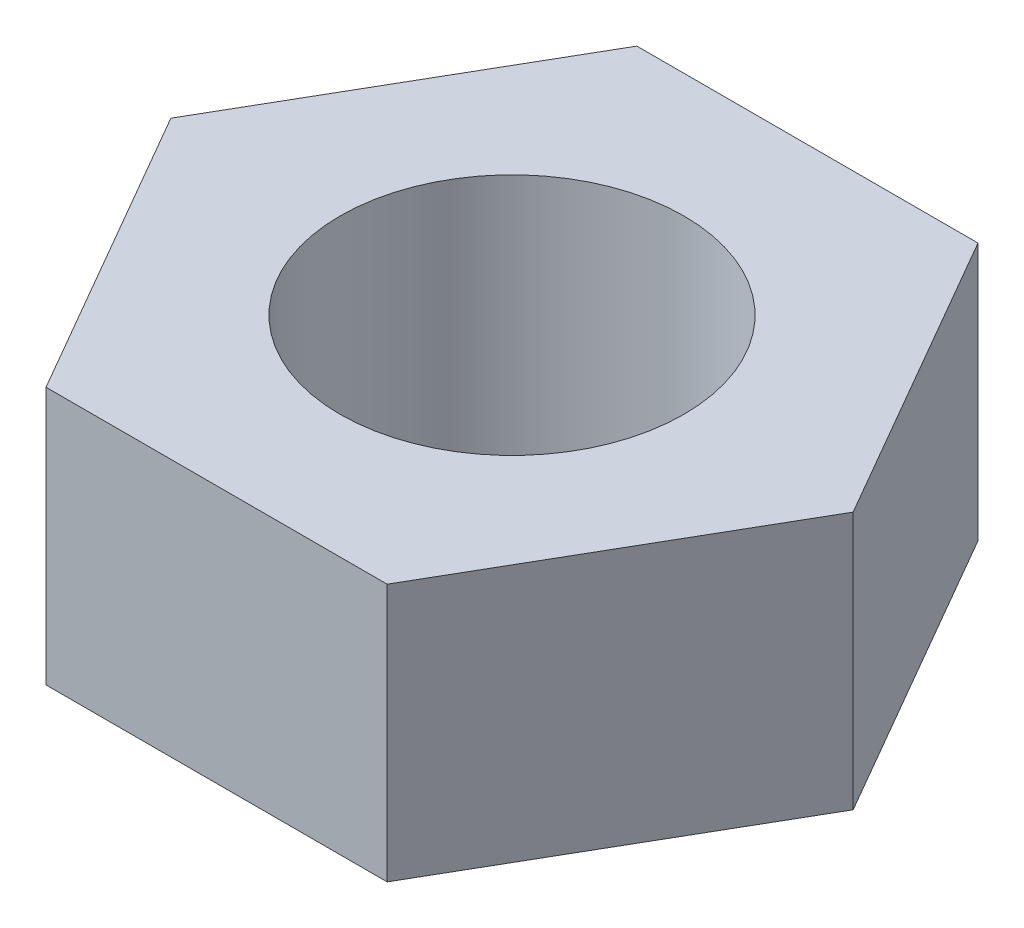
ISO-10303-21;
HEADER;
FILE_DESCRIPTION(('STEP AP214'),'2;1');
FILE_NAME('part.step','',(''),(''),'','','');
FILE_SCHEMA(('AUTOMOTIVE_DESIGN { 1 0 10303 214 1 1 1 1 }'));
ENDSEC;
DATA;
#1=APPLICATION_CONTEXT('core data for automotive mechanical design processes');
#2=APPLICATION_PROTOCOL_DEFINITION('international standard','automotive_design',2000,#1);
#3=PRODUCT_CONTEXT('',#1,'mechanical');
#4=PRODUCT('Part','Part','',(#3));
#5=PRODUCT_RELATED_PRODUCT_CATEGORY('part','',(#4));
#6=PRODUCT_DEFINITION_FORMATION('','',#4);
#7=PRODUCT_DEFINITION_CONTEXT('part definition',#1,'design');
#8=PRODUCT_DEFINITION('design','',#6,#7);
#9=PRODUCT_DEFINITION_SHAPE('','',#8);
#10=(LENGTH_UNIT() NAMED_UNIT(*) SI_UNIT(.MILLI.,.METRE.));
#11=(NAMED_UNIT(*) PLANE_ANGLE_UNIT() SI_UNIT($,.RADIAN.));
#12=(NAMED_UNIT(*) SI_UNIT($,.STERADIAN.) SOLID_ANGLE_UNIT());
#13=UNCERTAINTY_MEASURE_WITH_UNIT(LENGTH_MEASURE(1.E-05),#10,'distance_accuracy_value','');
#14=(GEOMETRIC_REPRESENTATION_CONTEXT(3) GLOBAL_UNCERTAINTY_ASSIGNED_CONTEXT((#13)) GLOBAL_UNIT_ASSIGNED_CONTEXT((#10,
#11,#12)) REPRESENTATION_CONTEXT('',''));
#15=CARTESIAN_POINT('',(0.,0.,0.));
#16=DIRECTION('',(0.,0.,1.));
#17=DIRECTION('',(1.,0.,0.));
#18=AXIS2_PLACEMENT_3D('',#15,#16,#17);
#19=CARTESIAN_POINT('',(0.,159.9,0.));
#20=DIRECTION('',(0.,1.,0.));
#21=DIRECTION('',(0.,0.,1.));
#22=AXIS2_PLACEMENT_3D('',#19,#20,#21);
#23=PLANE('',#22);
#24=DIRECTION('',(1.,0.,0.));
#25=VECTOR('',#24,1.);
#26=CARTESIAN_POINT('',(-57.87936448626,159.9,52.75));
#27=LINE('',#26,#25);
#28=CARTESIAN_POINT('',(-57.87936448626,159.9,52.75));
#29=VERTEX_POINT('',#28);
#30=CARTESIAN_POINT('',(-54.7039380057171,159.9,52.75));
#31=VERTEX_POINT('',#30);
#32=EDGE_CURVE('E137',#29,#31,#27,.T.);
#33=ORIENTED_EDGE('',*,*,#32,.T.);
#34=DIRECTION('',(0.500000000000002,0.,-0.866025403784437));
#35=VECTOR('',#34,1.);
#36=CARTESIAN_POINT('',(-54.7039380057171,159.9,52.75));
#37=LINE('',#36,#35);
#38=CARTESIAN_POINT('',(-53.1162247654456,159.9,50.));
#39=VERTEX_POINT('',#38);
#40=EDGE_CURVE('E92',#31,#39,#37,.T.);
#41=ORIENTED_EDGE('',*,*,#40,.T.);
#42=DIRECTION('',(-0.499999999999998,0.,-0.86602540378444));
#43=VECTOR('',#42,1.);
#44=CARTESIAN_POINT('',(-53.1162247654456,159.9,50.));
#45=LINE('',#44,#43);
#46=CARTESIAN_POINT('',(-54.703938005717,159.9,47.25));
#47=VERTEX_POINT('',#46);
#48=EDGE_CURVE('E107',#39,#47,#45,.T.);
#49=ORIENTED_EDGE('',*,*,#48,.T.);
#50=DIRECTION('',(-1.,0.,0.));
#51=VECTOR('',#50,1.);
#52=CARTESIAN_POINT('',(-54.703938005717,159.9,47.25));
#53=LINE('',#52,#51);
#54=CARTESIAN_POINT('',(-57.87936448626,159.9,47.25));
#55=VERTEX_POINT('',#54);
#56=EDGE_CURVE('E105',#47,#55,#53,.T.);
#57=ORIENTED_EDGE('',*,*,#56,.T.);
#58=DIRECTION('',(-0.5,0.,0.866025403784438));
#59=VECTOR('',#58,1.);
#60=CARTESIAN_POINT('',(-57.87936448626,159.9,47.25));
#61=LINE('',#60,#59);
#62=CARTESIAN_POINT('',(-59.4670777265315,159.9,50.));
#63=VERTEX_POINT('',#62);
#64=EDGE_CURVE('E106',#55,#63,#61,.T.);
#65=ORIENTED_EDGE('',*,*,#64,.T.);
#66=DIRECTION('',(0.500000000000001,0.,0.866025403784438));
#67=VECTOR('',#66,1.);
#68=CARTESIAN_POINT('',(-59.4670777265315,159.9,50.));
#69=LINE('',#68,#67);
#70=EDGE_CURVE('E59',#63,#29,#69,.T.);
#71=ORIENTED_EDGE('',*,*,#70,.T.);
#72=EDGE_LOOP('',(#33,#41,#49,#57,#65,#71));
#73=FACE_BOUND('',#72,.T.);
#74=CARTESIAN_POINT('',(-56.2916512459885,159.9,50.));
#75=DIRECTION('',(0.,1.,0.));
#76=DIRECTION('',(0.,0.,1.));
#77=AXIS2_PLACEMENT_3D('',#74,#75,#76);
#78=CIRCLE('',#77,1.6);
#79=CARTESIAN_POINT('',(-56.2916512459885,159.9,51.6));
#80=VERTEX_POINT('',#79);
#81=EDGE_CURVE('E128',#80,#80,#78,.T.);
#82=ORIENTED_EDGE('',*,*,#81,.F.);
#83=EDGE_LOOP('',(#82));
#84=FACE_BOUND('',#83,.T.);
#85=ADVANCED_FACE('F41',(#73,#84),#23,.T.);
#86=CARTESIAN_POINT('',(0.,157.5,0.));
#87=DIRECTION('',(0.,1.,0.));
#88=DIRECTION('',(0.,0.,1.));
#89=AXIS2_PLACEMENT_3D('',#86,#87,#88);
#90=PLANE('',#89);
#91=DIRECTION('',(1.,0.,0.));
#92=VECTOR('',#91,1.);
#93=CARTESIAN_POINT('',(-57.87936448626,157.5,52.75));
#94=LINE('',#93,#92);
#95=CARTESIAN_POINT('',(-57.87936448626,157.5,52.75));
#96=VERTEX_POINT('',#95);
#97=CARTESIAN_POINT('',(-54.7039380057171,157.5,52.75));
#98=VERTEX_POINT('',#97);
#99=EDGE_CURVE('E127',#96,#98,#94,.T.);
#100=ORIENTED_EDGE('',*,*,#99,.F.);
#101=DIRECTION('',(0.500000000000001,0.,0.866025403784438));
#102=VECTOR('',#101,1.);
#103=CARTESIAN_POINT('',(-59.4670777265315,157.5,50.));
#104=LINE('',#103,#102);
#105=CARTESIAN_POINT('',(-59.4670777265315,157.5,50.));
#106=VERTEX_POINT('',#105);
#107=EDGE_CURVE('E87',#106,#96,#104,.T.);
#108=ORIENTED_EDGE('',*,*,#107,.F.);
#109=DIRECTION('',(-0.5,0.,0.866025403784438));
#110=VECTOR('',#109,1.);
#111=CARTESIAN_POINT('',(-57.87936448626,157.5,47.25));
#112=LINE('',#111,#110);
#113=CARTESIAN_POINT('',(-57.87936448626,157.5,47.25));
#114=VERTEX_POINT('',#113);
#115=EDGE_CURVE('E81',#114,#106,#112,.T.);
#116=ORIENTED_EDGE('',*,*,#115,.F.);
#117=DIRECTION('',(-1.,0.,0.));
#118=VECTOR('',#117,1.);
#119=CARTESIAN_POINT('',(-54.703938005717,157.5,47.25));
#120=LINE('',#119,#118);
#121=CARTESIAN_POINT('',(-54.703938005717,157.5,47.25));
#122=VERTEX_POINT('',#121);
#123=EDGE_CURVE('E117',#122,#114,#120,.T.);
#124=ORIENTED_EDGE('',*,*,#123,.F.);
#125=DIRECTION('',(-0.499999999999998,0.,-0.86602540378444));
#126=VECTOR('',#125,1.);
#127=CARTESIAN_POINT('',(-53.1162247654456,157.5,50.));
#128=LINE('',#127,#126);
#129=CARTESIAN_POINT('',(-53.1162247654456,157.5,50.));
#130=VERTEX_POINT('',#129);
#131=EDGE_CURVE('E135',#130,#122,#128,.T.);
#132=ORIENTED_EDGE('',*,*,#131,.F.);
#133=DIRECTION('',(0.500000000000002,0.,-0.866025403784437));
#134=VECTOR('',#133,1.);
#135=CARTESIAN_POINT('',(-54.7039380057171,157.5,52.75));
#136=LINE('',#135,#134);
#137=EDGE_CURVE('E129',#98,#130,#136,.T.);
#138=ORIENTED_EDGE('',*,*,#137,.F.);
#139=EDGE_LOOP('',(#100,#108,#116,#124,#132,#138));
#140=FACE_BOUND('',#139,.T.);
#141=CARTESIAN_POINT('',(-56.2916512459885,157.5,50.));
#142=DIRECTION('',(0.,1.,0.));
#143=DIRECTION('',(0.,0.,1.));
#144=AXIS2_PLACEMENT_3D('',#141,#142,#143);
#145=CIRCLE('',#144,1.6);
#146=CARTESIAN_POINT('',(-56.2916512459885,157.5,51.6));
#147=VERTEX_POINT('',#146);
#148=EDGE_CURVE('E228',#147,#147,#145,.T.);
#149=ORIENTED_EDGE('',*,*,#148,.T.);
#150=EDGE_LOOP('',(#149));
#151=FACE_BOUND('',#150,.T.);
#152=ADVANCED_FACE('F148',(#140,#151),#90,.F.);
#153=CARTESIAN_POINT('',(-57.87936448626,159.9,52.75));
#154=DIRECTION('',(0.,0.,-1.));
#155=DIRECTION('',(-1.,0.,0.));
#156=AXIS2_PLACEMENT_3D('',#153,#154,#155);
#157=PLANE('',#156);
#158=ORIENTED_EDGE('',*,*,#99,.T.);
#159=DIRECTION('',(0.,-1.,0.));
#160=VECTOR('',#159,1.);
#161=CARTESIAN_POINT('',(-54.7039380057171,159.9,52.75));
#162=LINE('',#161,#160);
#163=EDGE_CURVE('E11',#31,#98,#162,.T.);
#164=ORIENTED_EDGE('',*,*,#163,.F.);
#165=ORIENTED_EDGE('',*,*,#32,.F.);
#166=DIRECTION('',(0.,-1.,0.));
#167=VECTOR('',#166,1.);
#168=CARTESIAN_POINT('',(-57.87936448626,159.9,52.75));
#169=LINE('',#168,#167);
#170=EDGE_CURVE('E122',#29,#96,#169,.T.);
#171=ORIENTED_EDGE('',*,*,#170,.T.);
#172=EDGE_LOOP('',(#158,#164,#165,#171));
#173=FACE_BOUND('',#172,.T.);
#174=ADVANCED_FACE('F43',(#173),#157,.F.);
#175=CARTESIAN_POINT('',(-54.7039380057171,159.9,52.75));
#176=DIRECTION('',(-0.866025403784437,0.,-0.500000000000002));
#177=DIRECTION('',(-0.500000000000002,0.,0.866025403784437));
#178=AXIS2_PLACEMENT_3D('',#175,#176,#177);
#179=PLANE('',#178);
#180=ORIENTED_EDGE('',*,*,#137,.T.);
#181=DIRECTION('',(0.,-1.,0.));
#182=VECTOR('',#181,1.);
#183=CARTESIAN_POINT('',(-53.1162247654456,159.9,50.));
#184=LINE('',#183,#182);
#185=EDGE_CURVE('E49',#39,#130,#184,.T.);
#186=ORIENTED_EDGE('',*,*,#185,.F.);
#187=ORIENTED_EDGE('',*,*,#40,.F.);
#188=ORIENTED_EDGE('',*,*,#163,.T.);
#189=EDGE_LOOP('',(#180,#186,#187,#188));
#190=FACE_BOUND('',#189,.T.);
#191=ADVANCED_FACE('F172',(#190),#179,.F.);
#192=CARTESIAN_POINT('',(-53.1162247654456,159.9,50.));
#193=DIRECTION('',(-0.86602540378444,0.,0.499999999999998));
#194=DIRECTION('',(0.499999999999998,0.,0.86602540378444));
#195=AXIS2_PLACEMENT_3D('',#192,#193,#194);
#196=PLANE('',#195);
#197=ORIENTED_EDGE('',*,*,#131,.T.);
#198=DIRECTION('',(0.,-1.,0.));
#199=VECTOR('',#198,1.);
#200=CARTESIAN_POINT('',(-54.703938005717,159.9,47.25));
#201=LINE('',#200,#199);
#202=EDGE_CURVE('E120',#47,#122,#201,.T.);
#203=ORIENTED_EDGE('',*,*,#202,.F.);
#204=ORIENTED_EDGE('',*,*,#48,.F.);
#205=ORIENTED_EDGE('',*,*,#185,.T.);
#206=EDGE_LOOP('',(#197,#203,#204,#205));
#207=FACE_BOUND('',#206,.T.);
#208=ADVANCED_FACE('F141',(#207),#196,.F.);
#209=CARTESIAN_POINT('',(-54.703938005717,159.9,47.25));
#210=DIRECTION('',(0.,0.,1.));
#211=DIRECTION('',(1.,0.,0.));
#212=AXIS2_PLACEMENT_3D('',#209,#210,#211);
#213=PLANE('',#212);
#214=ORIENTED_EDGE('',*,*,#123,.T.);
#215=DIRECTION('',(0.,-1.,0.));
#216=VECTOR('',#215,1.);
#217=CARTESIAN_POINT('',(-57.87936448626,159.9,47.25));
#218=LINE('',#217,#216);
#219=EDGE_CURVE('E114',#55,#114,#218,.T.);
#220=ORIENTED_EDGE('',*,*,#219,.F.);
#221=ORIENTED_EDGE('',*,*,#56,.F.);
#222=ORIENTED_EDGE('',*,*,#202,.T.);
#223=EDGE_LOOP('',(#214,#220,#221,#222));
#224=FACE_BOUND('',#223,.T.);
#225=ADVANCED_FACE('F111',(#224),#213,.F.);
#226=CARTESIAN_POINT('',(-57.87936448626,159.9,47.25));
#227=DIRECTION('',(0.866025403784438,0.,0.5));
#228=DIRECTION('',(0.5,0.,-0.866025403784438));
#229=AXIS2_PLACEMENT_3D('',#226,#227,#228);
#230=PLANE('',#229);
#231=ORIENTED_EDGE('',*,*,#115,.T.);
#232=DIRECTION('',(0.,-1.,0.));
#233=VECTOR('',#232,1.);
#234=CARTESIAN_POINT('',(-59.4670777265315,159.9,50.));
#235=LINE('',#234,#233);
#236=EDGE_CURVE('E119',#63,#106,#235,.T.);
#237=ORIENTED_EDGE('',*,*,#236,.F.);
#238=ORIENTED_EDGE('',*,*,#64,.F.);
#239=ORIENTED_EDGE('',*,*,#219,.T.);
#240=EDGE_LOOP('',(#231,#237,#238,#239));
#241=FACE_BOUND('',#240,.T.);
#242=ADVANCED_FACE('F118',(#241),#230,.F.);
#243=CARTESIAN_POINT('',(-59.4670777265315,159.9,50.));
#244=DIRECTION('',(0.866025403784438,0.,-0.500000000000001));
#245=DIRECTION('',(-0.500000000000001,0.,-0.866025403784438));
#246=AXIS2_PLACEMENT_3D('',#243,#244,#245);
#247=PLANE('',#246);
#248=ORIENTED_EDGE('',*,*,#107,.T.);
#249=ORIENTED_EDGE('',*,*,#170,.F.);
#250=ORIENTED_EDGE('',*,*,#70,.F.);
#251=ORIENTED_EDGE('',*,*,#236,.T.);
#252=EDGE_LOOP('',(#248,#249,#250,#251));
#253=FACE_BOUND('',#252,.T.);
#254=ADVANCED_FACE('F151',(#253),#247,.F.);
#255=CARTESIAN_POINT('',(-56.2916512459885,159.9,50.));
#256=DIRECTION('',(0.,-1.,0.));
#257=DIRECTION('',(0.,0.,-1.));
#258=AXIS2_PLACEMENT_3D('',#255,#256,#257);
#259=CYLINDRICAL_SURFACE('',#258,1.6);
#260=ORIENTED_EDGE('',*,*,#81,.T.);
#261=EDGE_LOOP('',(#260));
#262=FACE_BOUND('',#261,.T.);
#263=ORIENTED_EDGE('',*,*,#148,.F.);
#264=EDGE_LOOP('',(#263));
#265=FACE_BOUND('',#264,.T.);
#266=ADVANCED_FACE('F153',(#262,#265),#259,.F.);
#267=CLOSED_SHELL('',(#85,#152,#174,#191,#208,#225,#242,#254,#266));
#268=MANIFOLD_SOLID_BREP('B2',#267);
#269=ADVANCED_BREP_SHAPE_REPRESENTATION('',(#18,#268),#14);
#270=SHAPE_DEFINITION_REPRESENTATION(#9,#269);
ENDSEC;
END-ISO-10303-21;
